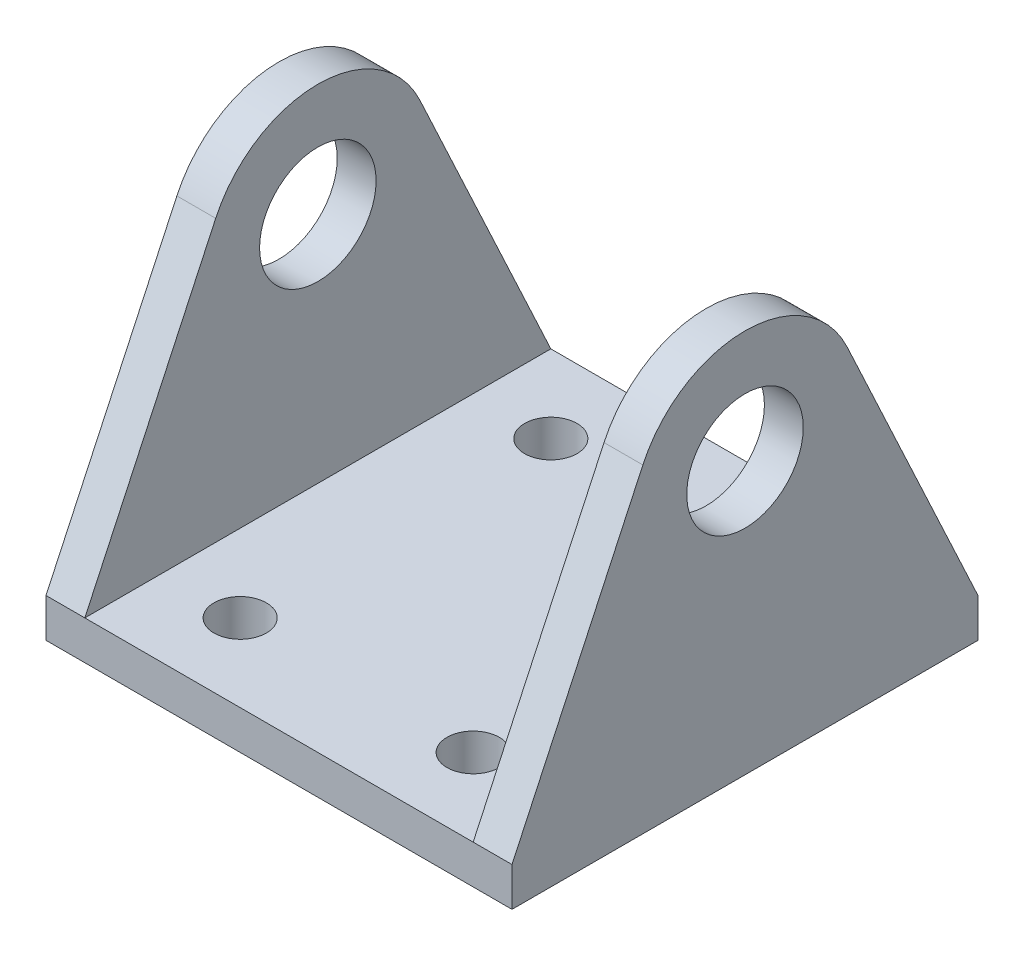
ISO-10303-21;
HEADER;
FILE_DESCRIPTION(('STEP AP214'),'2;1');
FILE_NAME('part.step','',(''),(''),'','','');
FILE_SCHEMA(('AUTOMOTIVE_DESIGN { 1 0 10303 214 1 1 1 1 }'));
ENDSEC;
DATA;
#1=APPLICATION_CONTEXT('core data for automotive mechanical design processes');
#2=APPLICATION_PROTOCOL_DEFINITION('international standard','automotive_design',2000,#1);
#3=PRODUCT_CONTEXT('',#1,'mechanical');
#4=PRODUCT('Part','Part','',(#3));
#5=PRODUCT_RELATED_PRODUCT_CATEGORY('part','',(#4));
#6=PRODUCT_DEFINITION_FORMATION('','',#4);
#7=PRODUCT_DEFINITION_CONTEXT('part definition',#1,'design');
#8=PRODUCT_DEFINITION('design','',#6,#7);
#9=PRODUCT_DEFINITION_SHAPE('','',#8);
#10=(LENGTH_UNIT() NAMED_UNIT(*) SI_UNIT(.MILLI.,.METRE.));
#11=(NAMED_UNIT(*) PLANE_ANGLE_UNIT() SI_UNIT($,.RADIAN.));
#12=(NAMED_UNIT(*) SI_UNIT($,.STERADIAN.) SOLID_ANGLE_UNIT());
#13=UNCERTAINTY_MEASURE_WITH_UNIT(LENGTH_MEASURE(1.E-05),#10,'distance_accuracy_value','');
#14=(GEOMETRIC_REPRESENTATION_CONTEXT(3) GLOBAL_UNCERTAINTY_ASSIGNED_CONTEXT((#13)) GLOBAL_UNIT_ASSIGNED_CONTEXT((#10,
#11,#12)) REPRESENTATION_CONTEXT('',''));
#15=CARTESIAN_POINT('',(0.,0.,0.));
#16=DIRECTION('',(0.,0.,1.));
#17=DIRECTION('',(1.,0.,0.));
#18=AXIS2_PLACEMENT_3D('',#15,#16,#17);
#19=CARTESIAN_POINT('',(-149.414874048411,82.2649615841655,-86.3022949970265));
#20=DIRECTION('',(0.,0.422618261740703,-0.906307787036648));
#21=DIRECTION('',(0.,0.906307787036648,0.422618261740704));
#22=AXIS2_PLACEMENT_3D('',#19,#20,#21);
#23=PLANE('',#22);
#24=DIRECTION('',(0.,0.906307787036648,0.422618261740704));
#25=VECTOR('',#24,1.);
#26=CARTESIAN_POINT('',(10.,82.2649615841655,-86.3022949970265));
#27=LINE('',#26,#25);
#28=CARTESIAN_POINT('',(10.,10.,-120.));
#29=VERTEX_POINT('',#28);
#30=CARTESIAN_POINT('',(10.,82.2649615841655,-86.3022949970265));
#31=VERTEX_POINT('',#30);
#32=EDGE_CURVE('E125',#29,#31,#27,.T.);
#33=ORIENTED_EDGE('',*,*,#32,.F.);
#34=DIRECTION('',(-1.,0.,0.));
#35=VECTOR('',#34,1.);
#36=CARTESIAN_POINT('',(0.,10.,-120.));
#37=LINE('',#36,#35);
#38=CARTESIAN_POINT('',(0.,10.,-120.));
#39=VERTEX_POINT('',#38);
#40=EDGE_CURVE('E142',#29,#39,#37,.T.);
#41=ORIENTED_EDGE('',*,*,#40,.T.);
#42=DIRECTION('',(0.,-0.906307787036648,-0.422618261740704));
#43=VECTOR('',#42,1.);
#44=CARTESIAN_POINT('',(0.,82.2649615841655,-86.3022949970265));
#45=LINE('',#44,#43);
#46=CARTESIAN_POINT('',(0.,82.2649615841655,-86.3022949970265));
#47=VERTEX_POINT('',#46);
#48=EDGE_CURVE('E185',#47,#39,#45,.T.);
#49=ORIENTED_EDGE('',*,*,#48,.F.);
#50=DIRECTION('',(1.,0.,0.));
#51=VECTOR('',#50,1.);
#52=CARTESIAN_POINT('',(-149.414874048411,82.2649615841655,-86.3022949970265));
#53=LINE('',#52,#51);
#54=EDGE_CURVE('E144',#47,#31,#53,.T.);
#55=ORIENTED_EDGE('',*,*,#54,.T.);
#56=EDGE_LOOP('',(#33,#41,#49,#55));
#57=FACE_BOUND('',#56,.T.);
#58=ADVANCED_FACE('F33',(#57),#23,.T.);
#59=CARTESIAN_POINT('',(-149.414874048411,70.,-60.));
#60=DIRECTION('',(1.,0.,0.));
#61=DIRECTION('',(0.,0.,-1.));
#62=AXIS2_PLACEMENT_3D('',#59,#60,#61);
#63=CYLINDRICAL_SURFACE('',#62,29.0213715177567);
#64=CARTESIAN_POINT('',(10.,70.,-60.));
#65=DIRECTION('',(-1.,0.,0.));
#66=DIRECTION('',(0.,0.,1.));
#67=AXIS2_PLACEMENT_3D('',#64,#65,#66);
#68=CIRCLE('',#67,29.0213715177567);
#69=CARTESIAN_POINT('',(10.,82.2649615841655,-33.6977050029736));
#70=VERTEX_POINT('',#69);
#71=EDGE_CURVE('E146',#31,#70,#68,.F.);
#72=ORIENTED_EDGE('',*,*,#71,.F.);
#73=ORIENTED_EDGE('',*,*,#54,.F.);
#74=CARTESIAN_POINT('',(0.,70.,-60.));
#75=DIRECTION('',(1.,0.,0.));
#76=DIRECTION('',(0.,0.,-1.));
#77=AXIS2_PLACEMENT_3D('',#74,#75,#76);
#78=CIRCLE('',#77,29.0213715177567);
#79=CARTESIAN_POINT('',(0.,82.2649615841655,-33.6977050029735));
#80=VERTEX_POINT('',#79);
#81=EDGE_CURVE('E188',#80,#47,#78,.F.);
#82=ORIENTED_EDGE('',*,*,#81,.F.);
#83=DIRECTION('',(1.,0.,0.));
#84=VECTOR('',#83,1.);
#85=CARTESIAN_POINT('',(-149.414874048411,82.2649615841655,-33.6977050029735));
#86=LINE('',#85,#84);
#87=EDGE_CURVE('E190',#80,#70,#86,.T.);
#88=ORIENTED_EDGE('',*,*,#87,.T.);
#89=EDGE_LOOP('',(#72,#73,#82,#88));
#90=FACE_BOUND('',#89,.T.);
#91=ADVANCED_FACE('F224',(#90),#63,.T.);
#92=CARTESIAN_POINT('',(-149.414874048411,10.,0.));
#93=DIRECTION('',(0.,0.422618261740704,0.906307787036648));
#94=DIRECTION('',(0.,-0.906307787036648,0.422618261740704));
#95=AXIS2_PLACEMENT_3D('',#92,#93,#94);
#96=PLANE('',#95);
#97=DIRECTION('',(0.,-0.906307787036648,0.422618261740704));
#98=VECTOR('',#97,1.);
#99=CARTESIAN_POINT('',(10.,10.,0.));
#100=LINE('',#99,#98);
#101=CARTESIAN_POINT('',(10.,10.,0.));
#102=VERTEX_POINT('',#101);
#103=EDGE_CURVE('E128',#70,#102,#100,.T.);
#104=ORIENTED_EDGE('',*,*,#103,.F.);
#105=ORIENTED_EDGE('',*,*,#87,.F.);
#106=DIRECTION('',(0.,0.906307787036648,-0.422618261740704));
#107=VECTOR('',#106,1.);
#108=CARTESIAN_POINT('',(0.,10.,0.));
#109=LINE('',#108,#107);
#110=CARTESIAN_POINT('',(0.,10.,0.));
#111=VERTEX_POINT('',#110);
#112=EDGE_CURVE('E187',#111,#80,#109,.T.);
#113=ORIENTED_EDGE('',*,*,#112,.F.);
#114=DIRECTION('',(1.,0.,0.));
#115=VECTOR('',#114,1.);
#116=CARTESIAN_POINT('',(0.,10.,0.));
#117=LINE('',#116,#115);
#118=EDGE_CURVE('E85',#111,#102,#117,.T.);
#119=ORIENTED_EDGE('',*,*,#118,.T.);
#120=EDGE_LOOP('',(#104,#105,#113,#119));
#121=FACE_BOUND('',#120,.T.);
#122=ADVANCED_FACE('F219',(#121),#96,.T.);
#123=CARTESIAN_POINT('',(-149.414874048411,70.,-60.));
#124=DIRECTION('',(1.,0.,0.));
#125=DIRECTION('',(0.,0.,-1.));
#126=AXIS2_PLACEMENT_3D('',#123,#124,#125);
#127=CYLINDRICAL_SURFACE('',#126,15.);
#128=CARTESIAN_POINT('',(10.,70.,-60.));
#129=DIRECTION('',(-1.,0.,0.));
#130=DIRECTION('',(0.,0.,1.));
#131=AXIS2_PLACEMENT_3D('',#128,#129,#130);
#132=CIRCLE('',#131,15.);
#133=CARTESIAN_POINT('',(10.,70.,-45.));
#134=VERTEX_POINT('',#133);
#135=EDGE_CURVE('E37',#134,#134,#132,.F.);
#136=ORIENTED_EDGE('',*,*,#135,.T.);
#137=EDGE_LOOP('',(#136));
#138=FACE_BOUND('',#137,.T.);
#139=CARTESIAN_POINT('',(0.,70.,-60.));
#140=DIRECTION('',(1.,0.,0.));
#141=DIRECTION('',(0.,0.,-1.));
#142=AXIS2_PLACEMENT_3D('',#139,#140,#141);
#143=CIRCLE('',#142,15.);
#144=CARTESIAN_POINT('',(0.,70.,-75.));
#145=VERTEX_POINT('',#144);
#146=EDGE_CURVE('E161',#145,#145,#143,.F.);
#147=ORIENTED_EDGE('',*,*,#146,.T.);
#148=EDGE_LOOP('',(#147));
#149=FACE_BOUND('',#148,.T.);
#150=ADVANCED_FACE('F209',(#138,#149),#127,.F.);
#151=CARTESIAN_POINT('',(0.,10.,0.));
#152=DIRECTION('',(1.,0.,0.));
#153=DIRECTION('',(0.,0.,-1.));
#154=AXIS2_PLACEMENT_3D('',#151,#152,#153);
#155=PLANE('',#154);
#156=DIRECTION('',(0.,0.,1.));
#157=VECTOR('',#156,1.);
#158=CARTESIAN_POINT('',(0.,0.,0.));
#159=LINE('',#158,#157);
#160=CARTESIAN_POINT('',(0.,0.,-120.));
#161=VERTEX_POINT('',#160);
#162=CARTESIAN_POINT('',(0.,0.,0.));
#163=VERTEX_POINT('',#162);
#164=EDGE_CURVE('E157',#161,#163,#159,.T.);
#165=ORIENTED_EDGE('',*,*,#164,.T.);
#166=DIRECTION('',(0.,-1.,0.));
#167=VECTOR('',#166,1.);
#168=CARTESIAN_POINT('',(0.,10.,0.));
#169=LINE('',#168,#167);
#170=EDGE_CURVE('E11',#111,#163,#169,.T.);
#171=ORIENTED_EDGE('',*,*,#170,.F.);
#172=ORIENTED_EDGE('',*,*,#112,.T.);
#173=ORIENTED_EDGE('',*,*,#81,.T.);
#174=ORIENTED_EDGE('',*,*,#48,.T.);
#175=DIRECTION('',(0.,-1.,0.));
#176=VECTOR('',#175,1.);
#177=CARTESIAN_POINT('',(0.,10.,-120.));
#178=LINE('',#177,#176);
#179=EDGE_CURVE('E149',#39,#161,#178,.T.);
#180=ORIENTED_EDGE('',*,*,#179,.T.);
#181=EDGE_LOOP('',(#165,#171,#172,#173,#174,#180));
#182=FACE_BOUND('',#181,.T.);
#183=ORIENTED_EDGE('',*,*,#146,.F.);
#184=EDGE_LOOP('',(#183));
#185=FACE_BOUND('',#184,.T.);
#186=ADVANCED_FACE('F35',(#182,#185),#155,.F.);
#187=CARTESIAN_POINT('',(0.,10.,0.));
#188=DIRECTION('',(0.,0.,-1.));
#189=DIRECTION('',(-1.,0.,0.));
#190=AXIS2_PLACEMENT_3D('',#187,#188,#189);
#191=PLANE('',#190);
#192=DIRECTION('',(1.,0.,0.));
#193=VECTOR('',#192,1.);
#194=CARTESIAN_POINT('',(0.,0.,0.));
#195=LINE('',#194,#193);
#196=CARTESIAN_POINT('',(120.,0.,0.));
#197=VERTEX_POINT('',#196);
#198=EDGE_CURVE('E160',#163,#197,#195,.T.);
#199=ORIENTED_EDGE('',*,*,#198,.T.);
#200=DIRECTION('',(0.,-1.,0.));
#201=VECTOR('',#200,1.);
#202=CARTESIAN_POINT('',(120.,10.,0.));
#203=LINE('',#202,#201);
#204=CARTESIAN_POINT('',(120.,10.,0.));
#205=VERTEX_POINT('',#204);
#206=EDGE_CURVE('E42',#205,#197,#203,.T.);
#207=ORIENTED_EDGE('',*,*,#206,.F.);
#208=CARTESIAN_POINT('',(110.,10.,0.));
#209=VERTEX_POINT('',#208);
#210=EDGE_CURVE('E153',#209,#205,#117,.T.);
#211=ORIENTED_EDGE('',*,*,#210,.F.);
#212=DIRECTION('',(1.,0.,0.));
#213=VECTOR('',#212,1.);
#214=CARTESIAN_POINT('',(10.,10.,0.));
#215=LINE('',#214,#213);
#216=EDGE_CURVE('E137',#102,#209,#215,.T.);
#217=ORIENTED_EDGE('',*,*,#216,.F.);
#218=ORIENTED_EDGE('',*,*,#118,.F.);
#219=ORIENTED_EDGE('',*,*,#170,.T.);
#220=EDGE_LOOP('',(#199,#207,#211,#217,#218,#219));
#221=FACE_BOUND('',#220,.T.);
#222=ADVANCED_FACE('F212',(#221),#191,.F.);
#223=CARTESIAN_POINT('',(120.,10.,0.));
#224=DIRECTION('',(-1.,0.,0.));
#225=DIRECTION('',(0.,0.,1.));
#226=AXIS2_PLACEMENT_3D('',#223,#224,#225);
#227=PLANE('',#226);
#228=DIRECTION('',(0.,0.,-1.));
#229=VECTOR('',#228,1.);
#230=CARTESIAN_POINT('',(120.,0.,0.));
#231=LINE('',#230,#229);
#232=CARTESIAN_POINT('',(120.,0.,-120.));
#233=VERTEX_POINT('',#232);
#234=EDGE_CURVE('E163',#197,#233,#231,.T.);
#235=ORIENTED_EDGE('',*,*,#234,.T.);
#236=DIRECTION('',(0.,-1.,0.));
#237=VECTOR('',#236,1.);
#238=CARTESIAN_POINT('',(120.,10.,-120.));
#239=LINE('',#238,#237);
#240=CARTESIAN_POINT('',(120.,10.,-120.));
#241=VERTEX_POINT('',#240);
#242=EDGE_CURVE('E59',#241,#233,#239,.T.);
#243=ORIENTED_EDGE('',*,*,#242,.F.);
#244=DIRECTION('',(0.,0.906307787036648,0.422618261740703));
#245=VECTOR('',#244,1.);
#246=CARTESIAN_POINT('',(120.,82.2649615841655,-86.3022949970265));
#247=LINE('',#246,#245);
#248=CARTESIAN_POINT('',(120.,82.2649615841655,-86.3022949970265));
#249=VERTEX_POINT('',#248);
#250=EDGE_CURVE('E194',#241,#249,#247,.T.);
#251=ORIENTED_EDGE('',*,*,#250,.T.);
#252=CARTESIAN_POINT('',(120.,70.,-60.));
#253=DIRECTION('',(1.,0.,0.));
#254=DIRECTION('',(0.,0.,-1.));
#255=AXIS2_PLACEMENT_3D('',#252,#253,#254);
#256=CIRCLE('',#255,29.0213715177567);
#257=CARTESIAN_POINT('',(120.,82.2649615841655,-33.6977050029735));
#258=VERTEX_POINT('',#257);
#259=EDGE_CURVE('E196',#249,#258,#256,.T.);
#260=ORIENTED_EDGE('',*,*,#259,.T.);
#261=DIRECTION('',(0.,-0.906307787036648,0.422618261740704));
#262=VECTOR('',#261,1.);
#263=CARTESIAN_POINT('',(120.,10.,0.));
#264=LINE('',#263,#262);
#265=EDGE_CURVE('E199',#258,#205,#264,.T.);
#266=ORIENTED_EDGE('',*,*,#265,.T.);
#267=ORIENTED_EDGE('',*,*,#206,.T.);
#268=EDGE_LOOP('',(#235,#243,#251,#260,#266,#267));
#269=FACE_BOUND('',#268,.T.);
#270=CARTESIAN_POINT('',(120.,70.,-60.));
#271=DIRECTION('',(1.,0.,0.));
#272=DIRECTION('',(0.,0.,-1.));
#273=AXIS2_PLACEMENT_3D('',#270,#271,#272);
#274=CIRCLE('',#273,15.);
#275=CARTESIAN_POINT('',(120.,70.,-75.));
#276=VERTEX_POINT('',#275);
#277=EDGE_CURVE('E145',#276,#276,#274,.T.);
#278=ORIENTED_EDGE('',*,*,#277,.F.);
#279=EDGE_LOOP('',(#278));
#280=FACE_BOUND('',#279,.T.);
#281=ADVANCED_FACE('F218',(#269,#280),#227,.F.);
#282=CARTESIAN_POINT('',(0.,10.,-120.));
#283=DIRECTION('',(0.,0.,1.));
#284=DIRECTION('',(1.,0.,0.));
#285=AXIS2_PLACEMENT_3D('',#282,#283,#284);
#286=PLANE('',#285);
#287=DIRECTION('',(-1.,0.,0.));
#288=VECTOR('',#287,1.);
#289=CARTESIAN_POINT('',(0.,0.,-120.));
#290=LINE('',#289,#288);
#291=EDGE_CURVE('E79',#233,#161,#290,.T.);
#292=ORIENTED_EDGE('',*,*,#291,.T.);
#293=ORIENTED_EDGE('',*,*,#179,.F.);
#294=ORIENTED_EDGE('',*,*,#40,.F.);
#295=DIRECTION('',(1.,0.,0.));
#296=VECTOR('',#295,1.);
#297=CARTESIAN_POINT('',(10.,10.,-120.));
#298=LINE('',#297,#296);
#299=CARTESIAN_POINT('',(110.,10.,-120.));
#300=VERTEX_POINT('',#299);
#301=EDGE_CURVE('E130',#29,#300,#298,.T.);
#302=ORIENTED_EDGE('',*,*,#301,.T.);
#303=EDGE_CURVE('E151',#241,#300,#37,.T.);
#304=ORIENTED_EDGE('',*,*,#303,.F.);
#305=ORIENTED_EDGE('',*,*,#242,.T.);
#306=EDGE_LOOP('',(#292,#293,#294,#302,#304,#305));
#307=FACE_BOUND('',#306,.T.);
#308=ADVANCED_FACE('F148',(#307),#286,.F.);
#309=CARTESIAN_POINT('',(0.,0.,0.));
#310=DIRECTION('',(0.,-1.,0.));
#311=DIRECTION('',(0.,0.,-1.));
#312=AXIS2_PLACEMENT_3D('',#309,#310,#311);
#313=PLANE('',#312);
#314=CARTESIAN_POINT('',(90.,0.,-20.));
#315=DIRECTION('',(0.,1.,0.));
#316=DIRECTION('',(0.,0.,1.));
#317=AXIS2_PLACEMENT_3D('',#314,#315,#316);
#318=CIRCLE('',#317,6.75);
#319=CARTESIAN_POINT('',(90.,0.,-13.25));
#320=VERTEX_POINT('',#319);
#321=EDGE_CURVE('E293',#320,#320,#318,.T.);
#322=ORIENTED_EDGE('',*,*,#321,.T.);
#323=EDGE_LOOP('',(#322));
#324=FACE_BOUND('',#323,.T.);
#325=CARTESIAN_POINT('',(90.,0.,-100.));
#326=DIRECTION('',(0.,1.,0.));
#327=DIRECTION('',(0.,0.,1.));
#328=AXIS2_PLACEMENT_3D('',#325,#326,#327);
#329=CIRCLE('',#328,6.75);
#330=CARTESIAN_POINT('',(90.,0.,-93.25));
#331=VERTEX_POINT('',#330);
#332=EDGE_CURVE('E301',#331,#331,#329,.T.);
#333=ORIENTED_EDGE('',*,*,#332,.T.);
#334=EDGE_LOOP('',(#333));
#335=FACE_BOUND('',#334,.T.);
#336=CARTESIAN_POINT('',(30.,0.,-100.));
#337=DIRECTION('',(0.,1.,0.));
#338=DIRECTION('',(0.,0.,1.));
#339=AXIS2_PLACEMENT_3D('',#336,#337,#338);
#340=CIRCLE('',#339,6.75000000000001);
#341=CARTESIAN_POINT('',(30.,0.,-93.25));
#342=VERTEX_POINT('',#341);
#343=EDGE_CURVE('E307',#342,#342,#340,.T.);
#344=ORIENTED_EDGE('',*,*,#343,.T.);
#345=EDGE_LOOP('',(#344));
#346=FACE_BOUND('',#345,.T.);
#347=CARTESIAN_POINT('',(30.,0.,-20.));
#348=DIRECTION('',(0.,1.,0.));
#349=DIRECTION('',(0.,0.,1.));
#350=AXIS2_PLACEMENT_3D('',#347,#348,#349);
#351=CIRCLE('',#350,6.75);
#352=CARTESIAN_POINT('',(30.,0.,-13.25));
#353=VERTEX_POINT('',#352);
#354=EDGE_CURVE('E313',#353,#353,#351,.T.);
#355=ORIENTED_EDGE('',*,*,#354,.T.);
#356=EDGE_LOOP('',(#355));
#357=FACE_BOUND('',#356,.T.);
#358=ORIENTED_EDGE('',*,*,#164,.F.);
#359=ORIENTED_EDGE('',*,*,#291,.F.);
#360=ORIENTED_EDGE('',*,*,#234,.F.);
#361=ORIENTED_EDGE('',*,*,#198,.F.);
#362=EDGE_LOOP('',(#358,#359,#360,#361));
#363=FACE_BOUND('',#362,.T.);
#364=ADVANCED_FACE('F235',(#324,#335,#346,#357,#363),#313,.T.);
#365=DIRECTION('',(0.,-0.906307787036648,-0.422618261740704));
#366=VECTOR('',#365,1.);
#367=CARTESIAN_POINT('',(110.,82.2649615841655,-86.3022949970265));
#368=LINE('',#367,#366);
#369=CARTESIAN_POINT('',(110.,82.2649615841655,-86.3022949970265));
#370=VERTEX_POINT('',#369);
#371=EDGE_CURVE('E181',#370,#300,#368,.T.);
#372=ORIENTED_EDGE('',*,*,#371,.F.);
#373=EDGE_CURVE('E202',#370,#249,#53,.T.);
#374=ORIENTED_EDGE('',*,*,#373,.T.);
#375=ORIENTED_EDGE('',*,*,#250,.F.);
#376=ORIENTED_EDGE('',*,*,#303,.T.);
#377=EDGE_LOOP('',(#372,#374,#375,#376));
#378=FACE_BOUND('',#377,.T.);
#379=ADVANCED_FACE('F226',(#378),#23,.T.);
#380=CARTESIAN_POINT('',(110.,70.,-60.));
#381=DIRECTION('',(1.,0.,0.));
#382=DIRECTION('',(0.,0.,-1.));
#383=AXIS2_PLACEMENT_3D('',#380,#381,#382);
#384=CIRCLE('',#383,29.0213715177567);
#385=CARTESIAN_POINT('',(110.,82.2649615841655,-33.6977050029736));
#386=VERTEX_POINT('',#385);
#387=EDGE_CURVE('E174',#386,#370,#384,.F.);
#388=ORIENTED_EDGE('',*,*,#387,.F.);
#389=EDGE_CURVE('E205',#386,#258,#86,.T.);
#390=ORIENTED_EDGE('',*,*,#389,.T.);
#391=ORIENTED_EDGE('',*,*,#259,.F.);
#392=ORIENTED_EDGE('',*,*,#373,.F.);
#393=EDGE_LOOP('',(#388,#390,#391,#392));
#394=FACE_BOUND('',#393,.T.);
#395=ADVANCED_FACE('F232',(#394),#63,.T.);
#396=DIRECTION('',(0.,0.906307787036648,-0.422618261740704));
#397=VECTOR('',#396,1.);
#398=CARTESIAN_POINT('',(110.,10.,0.));
#399=LINE('',#398,#397);
#400=EDGE_CURVE('E171',#209,#386,#399,.T.);
#401=ORIENTED_EDGE('',*,*,#400,.F.);
#402=ORIENTED_EDGE('',*,*,#210,.T.);
#403=ORIENTED_EDGE('',*,*,#265,.F.);
#404=ORIENTED_EDGE('',*,*,#389,.F.);
#405=EDGE_LOOP('',(#401,#402,#403,#404));
#406=FACE_BOUND('',#405,.T.);
#407=ADVANCED_FACE('F241',(#406),#96,.T.);
#408=CARTESIAN_POINT('',(110.,70.,-60.));
#409=DIRECTION('',(1.,0.,0.));
#410=DIRECTION('',(0.,0.,-1.));
#411=AXIS2_PLACEMENT_3D('',#408,#409,#410);
#412=CIRCLE('',#411,15.);
#413=CARTESIAN_POINT('',(110.,70.,-75.));
#414=VERTEX_POINT('',#413);
#415=EDGE_CURVE('E169',#414,#414,#412,.F.);
#416=ORIENTED_EDGE('',*,*,#415,.T.);
#417=EDGE_LOOP('',(#416));
#418=FACE_BOUND('',#417,.T.);
#419=ORIENTED_EDGE('',*,*,#277,.T.);
#420=EDGE_LOOP('',(#419));
#421=FACE_BOUND('',#420,.T.);
#422=ADVANCED_FACE('F222',(#418,#421),#127,.F.);
#423=CARTESIAN_POINT('',(10.,10.,-120.));
#424=DIRECTION('',(-1.,0.,0.));
#425=DIRECTION('',(0.,0.,1.));
#426=AXIS2_PLACEMENT_3D('',#423,#424,#425);
#427=PLANE('',#426);
#428=ORIENTED_EDGE('',*,*,#32,.T.);
#429=ORIENTED_EDGE('',*,*,#71,.T.);
#430=ORIENTED_EDGE('',*,*,#103,.T.);
#431=DIRECTION('',(0.,0.,1.));
#432=VECTOR('',#431,1.);
#433=CARTESIAN_POINT('',(10.,10.,-120.));
#434=LINE('',#433,#432);
#435=EDGE_CURVE('E50',#29,#102,#434,.T.);
#436=ORIENTED_EDGE('',*,*,#435,.F.);
#437=EDGE_LOOP('',(#428,#429,#430,#436));
#438=FACE_BOUND('',#437,.T.);
#439=ORIENTED_EDGE('',*,*,#135,.F.);
#440=EDGE_LOOP('',(#439));
#441=FACE_BOUND('',#440,.T.);
#442=ADVANCED_FACE('F122',(#438,#441),#427,.F.);
#443=CARTESIAN_POINT('',(110.,10.,-120.));
#444=DIRECTION('',(1.,0.,0.));
#445=DIRECTION('',(0.,0.,-1.));
#446=AXIS2_PLACEMENT_3D('',#443,#444,#445);
#447=PLANE('',#446);
#448=ORIENTED_EDGE('',*,*,#371,.T.);
#449=DIRECTION('',(0.,0.,1.));
#450=VECTOR('',#449,1.);
#451=CARTESIAN_POINT('',(110.,10.,-120.));
#452=LINE('',#451,#450);
#453=EDGE_CURVE('E129',#300,#209,#452,.T.);
#454=ORIENTED_EDGE('',*,*,#453,.T.);
#455=ORIENTED_EDGE('',*,*,#400,.T.);
#456=ORIENTED_EDGE('',*,*,#387,.T.);
#457=EDGE_LOOP('',(#448,#454,#455,#456));
#458=FACE_BOUND('',#457,.T.);
#459=ORIENTED_EDGE('',*,*,#415,.F.);
#460=EDGE_LOOP('',(#459));
#461=FACE_BOUND('',#460,.T.);
#462=ADVANCED_FACE('F263',(#458,#461),#447,.F.);
#463=CARTESIAN_POINT('',(10.,10.,-120.));
#464=DIRECTION('',(0.,-1.,0.));
#465=DIRECTION('',(0.,0.,-1.));
#466=AXIS2_PLACEMENT_3D('',#463,#464,#465);
#467=PLANE('',#466);
#468=CARTESIAN_POINT('',(90.,10.,-20.));
#469=DIRECTION('',(0.,1.,0.));
#470=DIRECTION('',(0.,0.,1.));
#471=AXIS2_PLACEMENT_3D('',#468,#469,#470);
#472=CIRCLE('',#471,6.75);
#473=CARTESIAN_POINT('',(90.,10.,-13.25));
#474=VERTEX_POINT('',#473);
#475=EDGE_CURVE('E296',#474,#474,#472,.T.);
#476=ORIENTED_EDGE('',*,*,#475,.F.);
#477=EDGE_LOOP('',(#476));
#478=FACE_BOUND('',#477,.T.);
#479=CARTESIAN_POINT('',(90.,10.,-100.));
#480=DIRECTION('',(0.,1.,0.));
#481=DIRECTION('',(0.,0.,1.));
#482=AXIS2_PLACEMENT_3D('',#479,#480,#481);
#483=CIRCLE('',#482,6.75);
#484=CARTESIAN_POINT('',(90.,10.,-93.25));
#485=VERTEX_POINT('',#484);
#486=EDGE_CURVE('E298',#485,#485,#483,.T.);
#487=ORIENTED_EDGE('',*,*,#486,.F.);
#488=EDGE_LOOP('',(#487));
#489=FACE_BOUND('',#488,.T.);
#490=CARTESIAN_POINT('',(30.,10.,-100.));
#491=DIRECTION('',(0.,1.,0.));
#492=DIRECTION('',(0.,0.,1.));
#493=AXIS2_PLACEMENT_3D('',#490,#491,#492);
#494=CIRCLE('',#493,6.75000000000001);
#495=CARTESIAN_POINT('',(30.,10.,-93.25));
#496=VERTEX_POINT('',#495);
#497=EDGE_CURVE('E304',#496,#496,#494,.T.);
#498=ORIENTED_EDGE('',*,*,#497,.F.);
#499=EDGE_LOOP('',(#498));
#500=FACE_BOUND('',#499,.T.);
#501=CARTESIAN_POINT('',(30.,10.,-20.));
#502=DIRECTION('',(0.,1.,0.));
#503=DIRECTION('',(0.,0.,1.));
#504=AXIS2_PLACEMENT_3D('',#501,#502,#503);
#505=CIRCLE('',#504,6.75);
#506=CARTESIAN_POINT('',(30.,10.,-13.25));
#507=VERTEX_POINT('',#506);
#508=EDGE_CURVE('E310',#507,#507,#505,.T.);
#509=ORIENTED_EDGE('',*,*,#508,.F.);
#510=EDGE_LOOP('',(#509));
#511=FACE_BOUND('',#510,.T.);
#512=ORIENTED_EDGE('',*,*,#216,.T.);
#513=ORIENTED_EDGE('',*,*,#453,.F.);
#514=ORIENTED_EDGE('',*,*,#301,.F.);
#515=ORIENTED_EDGE('',*,*,#435,.T.);
#516=EDGE_LOOP('',(#512,#513,#514,#515));
#517=FACE_BOUND('',#516,.T.);
#518=ADVANCED_FACE('F134',(#478,#489,#500,#511,#517),#467,.F.);
#519=CARTESIAN_POINT('',(30.,0.,-20.));
#520=DIRECTION('',(0.,1.,0.));
#521=DIRECTION('',(0.,0.,1.));
#522=AXIS2_PLACEMENT_3D('',#519,#520,#521);
#523=CYLINDRICAL_SURFACE('',#522,6.75);
#524=ORIENTED_EDGE('',*,*,#354,.F.);
#525=EDGE_LOOP('',(#524));
#526=FACE_BOUND('',#525,.T.);
#527=ORIENTED_EDGE('',*,*,#508,.T.);
#528=EDGE_LOOP('',(#527));
#529=FACE_BOUND('',#528,.T.);
#530=ADVANCED_FACE('F270',(#526,#529),#523,.F.);
#531=CARTESIAN_POINT('',(30.,0.,-100.));
#532=DIRECTION('',(0.,1.,0.));
#533=DIRECTION('',(0.,0.,1.));
#534=AXIS2_PLACEMENT_3D('',#531,#532,#533);
#535=CYLINDRICAL_SURFACE('',#534,6.75000000000001);
#536=ORIENTED_EDGE('',*,*,#343,.F.);
#537=EDGE_LOOP('',(#536));
#538=FACE_BOUND('',#537,.T.);
#539=ORIENTED_EDGE('',*,*,#497,.T.);
#540=EDGE_LOOP('',(#539));
#541=FACE_BOUND('',#540,.T.);
#542=ADVANCED_FACE('F276',(#538,#541),#535,.F.);
#543=CARTESIAN_POINT('',(90.,0.,-100.));
#544=DIRECTION('',(0.,1.,0.));
#545=DIRECTION('',(0.,0.,1.));
#546=AXIS2_PLACEMENT_3D('',#543,#544,#545);
#547=CYLINDRICAL_SURFACE('',#546,6.75);
#548=ORIENTED_EDGE('',*,*,#332,.F.);
#549=EDGE_LOOP('',(#548));
#550=FACE_BOUND('',#549,.T.);
#551=ORIENTED_EDGE('',*,*,#486,.T.);
#552=EDGE_LOOP('',(#551));
#553=FACE_BOUND('',#552,.T.);
#554=ADVANCED_FACE('F280',(#550,#553),#547,.F.);
#555=CARTESIAN_POINT('',(90.,0.,-20.));
#556=DIRECTION('',(0.,1.,0.));
#557=DIRECTION('',(0.,0.,1.));
#558=AXIS2_PLACEMENT_3D('',#555,#556,#557);
#559=CYLINDRICAL_SURFACE('',#558,6.75);
#560=ORIENTED_EDGE('',*,*,#321,.F.);
#561=EDGE_LOOP('',(#560));
#562=FACE_BOUND('',#561,.T.);
#563=ORIENTED_EDGE('',*,*,#475,.T.);
#564=EDGE_LOOP('',(#563));
#565=FACE_BOUND('',#564,.T.);
#566=ADVANCED_FACE('F284',(#562,#565),#559,.F.);
#567=CLOSED_SHELL('',(#58,#91,#122,#150,#186,#222,#281,#308,#364,#379,#395,#407,#422,#442,#462,
#518,#530,#542,#554,#566));
#568=MANIFOLD_SOLID_BREP('B2',#567);
#569=ADVANCED_BREP_SHAPE_REPRESENTATION('',(#18,#568),#14);
#570=SHAPE_DEFINITION_REPRESENTATION(#9,#569);
ENDSEC;
END-ISO-10303-21;
